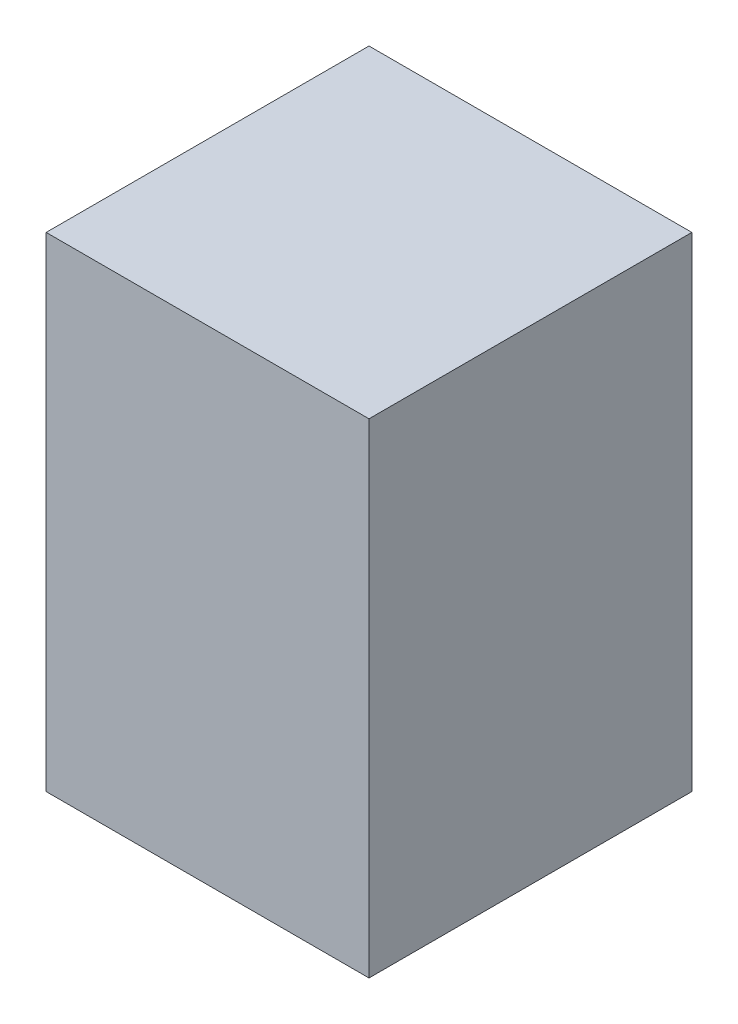
ISO-10303-21;
HEADER;
FILE_DESCRIPTION(('STEP AP214'),'2;1');
FILE_NAME('part.step','',(''),(''),'','','');
FILE_SCHEMA(('AUTOMOTIVE_DESIGN { 1 0 10303 214 1 1 1 1 }'));
ENDSEC;
DATA;
#1=APPLICATION_CONTEXT('core data for automotive mechanical design processes');
#2=APPLICATION_PROTOCOL_DEFINITION('international standard','automotive_design',2000,#1);
#3=PRODUCT_CONTEXT('',#1,'mechanical');
#4=PRODUCT('Part','Part','',(#3));
#5=PRODUCT_RELATED_PRODUCT_CATEGORY('part','',(#4));
#6=PRODUCT_DEFINITION_FORMATION('','',#4);
#7=PRODUCT_DEFINITION_CONTEXT('part definition',#1,'design');
#8=PRODUCT_DEFINITION('design','',#6,#7);
#9=PRODUCT_DEFINITION_SHAPE('','',#8);
#10=(LENGTH_UNIT() NAMED_UNIT(*) SI_UNIT(.MILLI.,.METRE.));
#11=(NAMED_UNIT(*) PLANE_ANGLE_UNIT() SI_UNIT($,.RADIAN.));
#12=(NAMED_UNIT(*) SI_UNIT($,.STERADIAN.) SOLID_ANGLE_UNIT());
#13=UNCERTAINTY_MEASURE_WITH_UNIT(LENGTH_MEASURE(1.E-05),#10,'distance_accuracy_value','');
#14=(GEOMETRIC_REPRESENTATION_CONTEXT(3) GLOBAL_UNCERTAINTY_ASSIGNED_CONTEXT((#13)) GLOBAL_UNIT_ASSIGNED_CONTEXT((#10,
#11,#12)) REPRESENTATION_CONTEXT('',''));
#15=CARTESIAN_POINT('',(0.,0.,0.));
#16=DIRECTION('',(0.,0.,1.));
#17=DIRECTION('',(1.,0.,0.));
#18=AXIS2_PLACEMENT_3D('',#15,#16,#17);
#19=CARTESIAN_POINT('',(60.,0.,-760.));
#20=DIRECTION('',(-1.,0.,0.));
#21=DIRECTION('',(0.,0.,1.));
#22=AXIS2_PLACEMENT_3D('',#19,#20,#21);
#23=PLANE('',#22);
#24=DIRECTION('',(0.,-1.,0.));
#25=VECTOR('',#24,1.);
#26=CARTESIAN_POINT('',(60.,0.,-680.));
#27=LINE('',#26,#25);
#28=CARTESIAN_POINT('',(60.,120.,-680.));
#29=VERTEX_POINT('',#28);
#30=CARTESIAN_POINT('',(60.,0.,-680.));
#31=VERTEX_POINT('',#30);
#32=EDGE_CURVE('E103',#29,#31,#27,.T.);
#33=ORIENTED_EDGE('',*,*,#32,.F.);
#34=DIRECTION('',(0.,0.,1.));
#35=VECTOR('',#34,1.);
#36=CARTESIAN_POINT('',(60.,120.,-760.));
#37=LINE('',#36,#35);
#38=CARTESIAN_POINT('',(60.,120.,-760.));
#39=VERTEX_POINT('',#38);
#40=EDGE_CURVE('E11',#39,#29,#37,.T.);
#41=ORIENTED_EDGE('',*,*,#40,.F.);
#42=DIRECTION('',(0.,-1.,0.));
#43=VECTOR('',#42,1.);
#44=CARTESIAN_POINT('',(60.,0.,-760.));
#45=LINE('',#44,#43);
#46=CARTESIAN_POINT('',(60.,0.,-760.));
#47=VERTEX_POINT('',#46);
#48=EDGE_CURVE('E97',#39,#47,#45,.T.);
#49=ORIENTED_EDGE('',*,*,#48,.T.);
#50=DIRECTION('',(0.,0.,1.));
#51=VECTOR('',#50,1.);
#52=CARTESIAN_POINT('',(60.,0.,-760.));
#53=LINE('',#52,#51);
#54=EDGE_CURVE('E42',#47,#31,#53,.T.);
#55=ORIENTED_EDGE('',*,*,#54,.T.);
#56=EDGE_LOOP('',(#33,#41,#49,#55));
#57=FACE_BOUND('',#56,.T.);
#58=ADVANCED_FACE('F39',(#57),#23,.T.);
#59=CARTESIAN_POINT('',(60.,120.,-760.));
#60=DIRECTION('',(0.,1.,0.));
#61=DIRECTION('',(0.,0.,1.));
#62=AXIS2_PLACEMENT_3D('',#59,#60,#61);
#63=PLANE('',#62);
#64=DIRECTION('',(-1.,0.,0.));
#65=VECTOR('',#64,1.);
#66=CARTESIAN_POINT('',(60.,120.,-680.));
#67=LINE('',#66,#65);
#68=CARTESIAN_POINT('',(140.,120.,-680.));
#69=VERTEX_POINT('',#68);
#70=EDGE_CURVE('E99',#69,#29,#67,.T.);
#71=ORIENTED_EDGE('',*,*,#70,.F.);
#72=DIRECTION('',(0.,0.,1.));
#73=VECTOR('',#72,1.);
#74=CARTESIAN_POINT('',(140.,120.,-760.));
#75=LINE('',#74,#73);
#76=CARTESIAN_POINT('',(140.,120.,-760.));
#77=VERTEX_POINT('',#76);
#78=EDGE_CURVE('E48',#77,#69,#75,.T.);
#79=ORIENTED_EDGE('',*,*,#78,.F.);
#80=DIRECTION('',(-1.,0.,0.));
#81=VECTOR('',#80,1.);
#82=CARTESIAN_POINT('',(60.,120.,-760.));
#83=LINE('',#82,#81);
#84=EDGE_CURVE('E94',#77,#39,#83,.T.);
#85=ORIENTED_EDGE('',*,*,#84,.T.);
#86=ORIENTED_EDGE('',*,*,#40,.T.);
#87=EDGE_LOOP('',(#71,#79,#85,#86));
#88=FACE_BOUND('',#87,.T.);
#89=ADVANCED_FACE('F113',(#88),#63,.T.);
#90=CARTESIAN_POINT('',(140.,0.,-760.));
#91=DIRECTION('',(1.,0.,0.));
#92=DIRECTION('',(0.,0.,-1.));
#93=AXIS2_PLACEMENT_3D('',#90,#91,#92);
#94=PLANE('',#93);
#95=DIRECTION('',(0.,1.,0.));
#96=VECTOR('',#95,1.);
#97=CARTESIAN_POINT('',(140.,0.,-680.));
#98=LINE('',#97,#96);
#99=CARTESIAN_POINT('',(140.,0.,-680.));
#100=VERTEX_POINT('',#99);
#101=EDGE_CURVE('E89',#100,#69,#98,.T.);
#102=ORIENTED_EDGE('',*,*,#101,.F.);
#103=DIRECTION('',(0.,0.,1.));
#104=VECTOR('',#103,1.);
#105=CARTESIAN_POINT('',(140.,0.,-760.));
#106=LINE('',#105,#104);
#107=CARTESIAN_POINT('',(140.,0.,-760.));
#108=VERTEX_POINT('',#107);
#109=EDGE_CURVE('E84',#108,#100,#106,.T.);
#110=ORIENTED_EDGE('',*,*,#109,.F.);
#111=DIRECTION('',(0.,1.,0.));
#112=VECTOR('',#111,1.);
#113=CARTESIAN_POINT('',(140.,0.,-760.));
#114=LINE('',#113,#112);
#115=EDGE_CURVE('E87',#108,#77,#114,.T.);
#116=ORIENTED_EDGE('',*,*,#115,.T.);
#117=ORIENTED_EDGE('',*,*,#78,.T.);
#118=EDGE_LOOP('',(#102,#110,#116,#117));
#119=FACE_BOUND('',#118,.T.);
#120=ADVANCED_FACE('F86',(#119),#94,.T.);
#121=CARTESIAN_POINT('',(60.,0.,-760.));
#122=DIRECTION('',(0.,-1.,0.));
#123=DIRECTION('',(0.,0.,-1.));
#124=AXIS2_PLACEMENT_3D('',#121,#122,#123);
#125=PLANE('',#124);
#126=DIRECTION('',(1.,0.,0.));
#127=VECTOR('',#126,1.);
#128=CARTESIAN_POINT('',(60.,0.,-680.));
#129=LINE('',#128,#127);
#130=EDGE_CURVE('E106',#31,#100,#129,.T.);
#131=ORIENTED_EDGE('',*,*,#130,.F.);
#132=ORIENTED_EDGE('',*,*,#54,.F.);
#133=DIRECTION('',(1.,0.,0.));
#134=VECTOR('',#133,1.);
#135=CARTESIAN_POINT('',(60.,0.,-760.));
#136=LINE('',#135,#134);
#137=EDGE_CURVE('E93',#47,#108,#136,.T.);
#138=ORIENTED_EDGE('',*,*,#137,.T.);
#139=ORIENTED_EDGE('',*,*,#109,.T.);
#140=EDGE_LOOP('',(#131,#132,#138,#139));
#141=FACE_BOUND('',#140,.T.);
#142=ADVANCED_FACE('F96',(#141),#125,.T.);
#143=CARTESIAN_POINT('',(0.,0.,-760.));
#144=DIRECTION('',(0.,0.,-1.));
#145=DIRECTION('',(-1.,0.,0.));
#146=AXIS2_PLACEMENT_3D('',#143,#144,#145);
#147=PLANE('',#146);
#148=ORIENTED_EDGE('',*,*,#48,.F.);
#149=ORIENTED_EDGE('',*,*,#84,.F.);
#150=ORIENTED_EDGE('',*,*,#115,.F.);
#151=ORIENTED_EDGE('',*,*,#137,.F.);
#152=EDGE_LOOP('',(#148,#149,#150,#151));
#153=FACE_BOUND('',#152,.T.);
#154=ADVANCED_FACE('F92',(#153),#147,.T.);
#155=CARTESIAN_POINT('',(0.,0.,-680.));
#156=DIRECTION('',(0.,0.,-1.));
#157=DIRECTION('',(-1.,0.,0.));
#158=AXIS2_PLACEMENT_3D('',#155,#156,#157);
#159=PLANE('',#158);
#160=ORIENTED_EDGE('',*,*,#32,.T.);
#161=ORIENTED_EDGE('',*,*,#130,.T.);
#162=ORIENTED_EDGE('',*,*,#101,.T.);
#163=ORIENTED_EDGE('',*,*,#70,.T.);
#164=EDGE_LOOP('',(#160,#161,#162,#163));
#165=FACE_BOUND('',#164,.T.);
#166=ADVANCED_FACE('F112',(#165),#159,.F.);
#167=CLOSED_SHELL('',(#58,#89,#120,#142,#154,#166));
#168=MANIFOLD_SOLID_BREP('B2',#167);
#169=ADVANCED_BREP_SHAPE_REPRESENTATION('',(#18,#168),#14);
#170=SHAPE_DEFINITION_REPRESENTATION(#9,#169);
ENDSEC;
END-ISO-10303-21;
